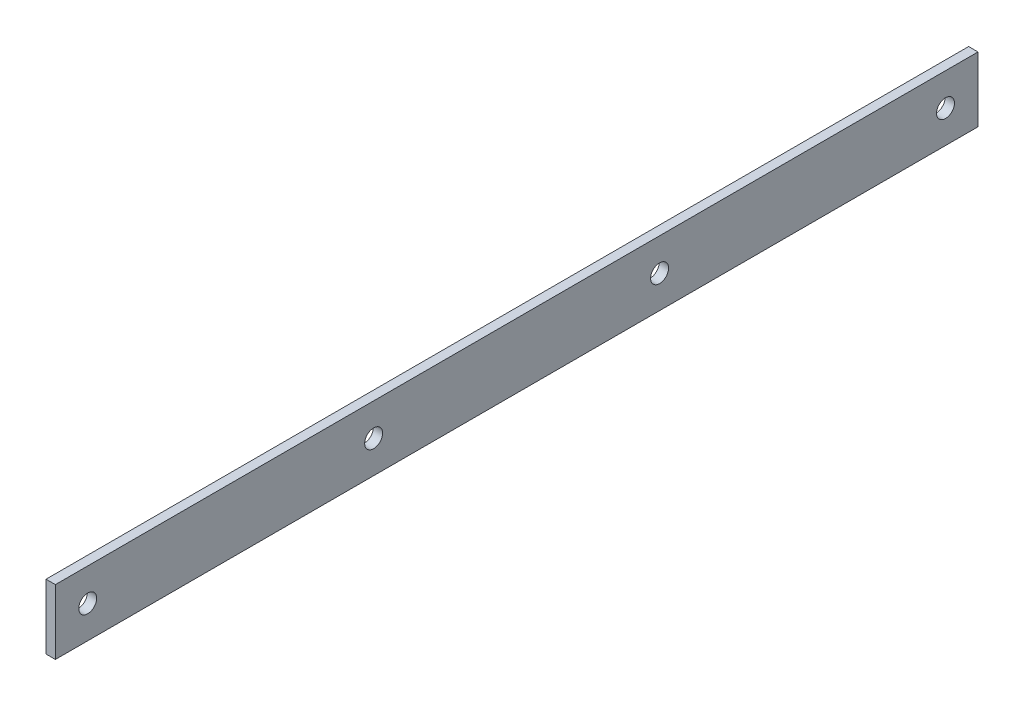
ISO-10303-21;
HEADER;
FILE_DESCRIPTION(('STEP AP214'),'2;1');
FILE_NAME('part.step','',(''),(''),'','','');
FILE_SCHEMA(('AUTOMOTIVE_DESIGN { 1 0 10303 214 1 1 1 1 }'));
ENDSEC;
DATA;
#1=APPLICATION_CONTEXT('core data for automotive mechanical design processes');
#2=APPLICATION_PROTOCOL_DEFINITION('international standard','automotive_design',2000,#1);
#3=PRODUCT_CONTEXT('',#1,'mechanical');
#4=PRODUCT('Part','Part','',(#3));
#5=PRODUCT_RELATED_PRODUCT_CATEGORY('part','',(#4));
#6=PRODUCT_DEFINITION_FORMATION('','',#4);
#7=PRODUCT_DEFINITION_CONTEXT('part definition',#1,'design');
#8=PRODUCT_DEFINITION('design','',#6,#7);
#9=PRODUCT_DEFINITION_SHAPE('','',#8);
#10=(LENGTH_UNIT() NAMED_UNIT(*) SI_UNIT(.MILLI.,.METRE.));
#11=(NAMED_UNIT(*) PLANE_ANGLE_UNIT() SI_UNIT($,.RADIAN.));
#12=(NAMED_UNIT(*) SI_UNIT($,.STERADIAN.) SOLID_ANGLE_UNIT());
#13=UNCERTAINTY_MEASURE_WITH_UNIT(LENGTH_MEASURE(1.E-05),#10,'distance_accuracy_value','');
#14=(GEOMETRIC_REPRESENTATION_CONTEXT(3) GLOBAL_UNCERTAINTY_ASSIGNED_CONTEXT((#13)) GLOBAL_UNIT_ASSIGNED_CONTEXT((#10,
#11,#12)) REPRESENTATION_CONTEXT('',''));
#15=CARTESIAN_POINT('',(0.,0.,0.));
#16=DIRECTION('',(0.,0.,1.));
#17=DIRECTION('',(1.,0.,0.));
#18=AXIS2_PLACEMENT_3D('',#15,#16,#17);
#19=CARTESIAN_POINT('',(0.,0.,-548.9));
#20=DIRECTION('',(1.,0.,0.));
#21=DIRECTION('',(0.,0.,-1.));
#22=AXIS2_PLACEMENT_3D('',#19,#20,#21);
#23=CYLINDRICAL_SURFACE('',#22,11.4999999999999);
#24=CARTESIAN_POINT('',(0.,0.,-548.9));
#25=DIRECTION('',(1.,0.,0.));
#26=DIRECTION('',(0.,0.,-1.));
#27=AXIS2_PLACEMENT_3D('',#24,#25,#26);
#28=CIRCLE('',#27,11.4999999999999);
#29=CARTESIAN_POINT('',(0.,0.,-560.4));
#30=VERTEX_POINT('',#29);
#31=EDGE_CURVE('E41',#30,#30,#28,.T.);
#32=ORIENTED_EDGE('',*,*,#31,.F.);
#33=EDGE_LOOP('',(#32));
#34=FACE_BOUND('',#33,.T.);
#35=CARTESIAN_POINT('',(12.,0.,-548.9));
#36=DIRECTION('',(1.,0.,0.));
#37=DIRECTION('',(0.,0.,-1.));
#38=AXIS2_PLACEMENT_3D('',#35,#36,#37);
#39=CIRCLE('',#38,11.4999999999999);
#40=CARTESIAN_POINT('',(12.,0.,-560.4));
#41=VERTEX_POINT('',#40);
#42=EDGE_CURVE('E11',#41,#41,#39,.T.);
#43=ORIENTED_EDGE('',*,*,#42,.T.);
#44=EDGE_LOOP('',(#43));
#45=FACE_BOUND('',#44,.T.);
#46=ADVANCED_FACE('F33',(#34,#45),#23,.F.);
#47=CARTESIAN_POINT('',(0.,0.,-182.9));
#48=DIRECTION('',(1.,0.,0.));
#49=DIRECTION('',(0.,0.,-1.));
#50=AXIS2_PLACEMENT_3D('',#47,#48,#49);
#51=CYLINDRICAL_SURFACE('',#50,11.4999999999999);
#52=CARTESIAN_POINT('',(0.,0.,-182.9));
#53=DIRECTION('',(1.,0.,0.));
#54=DIRECTION('',(0.,0.,-1.));
#55=AXIS2_PLACEMENT_3D('',#52,#53,#54);
#56=CIRCLE('',#55,11.4999999999999);
#57=CARTESIAN_POINT('',(0.,0.,-194.4));
#58=VERTEX_POINT('',#57);
#59=EDGE_CURVE('E111',#58,#58,#56,.T.);
#60=ORIENTED_EDGE('',*,*,#59,.F.);
#61=EDGE_LOOP('',(#60));
#62=FACE_BOUND('',#61,.T.);
#63=CARTESIAN_POINT('',(12.,0.,-182.9));
#64=DIRECTION('',(1.,0.,0.));
#65=DIRECTION('',(0.,0.,-1.));
#66=AXIS2_PLACEMENT_3D('',#63,#64,#65);
#67=CIRCLE('',#66,11.4999999999999);
#68=CARTESIAN_POINT('',(12.,0.,-194.4));
#69=VERTEX_POINT('',#68);
#70=EDGE_CURVE('E114',#69,#69,#67,.T.);
#71=ORIENTED_EDGE('',*,*,#70,.T.);
#72=EDGE_LOOP('',(#71));
#73=FACE_BOUND('',#72,.T.);
#74=ADVANCED_FACE('F123',(#62,#73),#51,.F.);
#75=CARTESIAN_POINT('',(12.,-41.5,-590.5));
#76=DIRECTION('',(0.,0.,1.));
#77=DIRECTION('',(1.,0.,0.));
#78=AXIS2_PLACEMENT_3D('',#75,#76,#77);
#79=PLANE('',#78);
#80=DIRECTION('',(0.,1.,0.));
#81=VECTOR('',#80,1.);
#82=CARTESIAN_POINT('',(0.,-41.5,-590.5));
#83=LINE('',#82,#81);
#84=CARTESIAN_POINT('',(0.,-41.5,-590.5));
#85=VERTEX_POINT('',#84);
#86=CARTESIAN_POINT('',(0.,41.5,-590.5));
#87=VERTEX_POINT('',#86);
#88=EDGE_CURVE('E101',#85,#87,#83,.T.);
#89=ORIENTED_EDGE('',*,*,#88,.T.);
#90=DIRECTION('',(-1.,0.,0.));
#91=VECTOR('',#90,1.);
#92=CARTESIAN_POINT('',(12.,41.5,-590.5));
#93=LINE('',#92,#91);
#94=CARTESIAN_POINT('',(12.,41.5,-590.5));
#95=VERTEX_POINT('',#94);
#96=EDGE_CURVE('E92',#95,#87,#93,.T.);
#97=ORIENTED_EDGE('',*,*,#96,.F.);
#98=DIRECTION('',(0.,1.,0.));
#99=VECTOR('',#98,1.);
#100=CARTESIAN_POINT('',(12.,-41.5,-590.5));
#101=LINE('',#100,#99);
#102=CARTESIAN_POINT('',(12.,-41.5,-590.5));
#103=VERTEX_POINT('',#102);
#104=EDGE_CURVE('E86',#103,#95,#101,.T.);
#105=ORIENTED_EDGE('',*,*,#104,.F.);
#106=DIRECTION('',(-1.,0.,0.));
#107=VECTOR('',#106,1.);
#108=CARTESIAN_POINT('',(12.,-41.5,-590.5));
#109=LINE('',#108,#107);
#110=EDGE_CURVE('E97',#103,#85,#109,.T.);
#111=ORIENTED_EDGE('',*,*,#110,.T.);
#112=EDGE_LOOP('',(#89,#97,#105,#111));
#113=FACE_BOUND('',#112,.T.);
#114=ADVANCED_FACE('F147',(#113),#79,.F.);
#115=CARTESIAN_POINT('',(12.,41.5,590.5));
#116=DIRECTION('',(0.,-1.,0.));
#117=DIRECTION('',(0.,0.,-1.));
#118=AXIS2_PLACEMENT_3D('',#115,#116,#117);
#119=PLANE('',#118);
#120=DIRECTION('',(0.,0.,1.));
#121=VECTOR('',#120,1.);
#122=CARTESIAN_POINT('',(0.,41.5,590.5));
#123=LINE('',#122,#121);
#124=CARTESIAN_POINT('',(0.,41.5,590.5));
#125=VERTEX_POINT('',#124);
#126=EDGE_CURVE('E91',#87,#125,#123,.T.);
#127=ORIENTED_EDGE('',*,*,#126,.T.);
#128=DIRECTION('',(-1.,0.,0.));
#129=VECTOR('',#128,1.);
#130=CARTESIAN_POINT('',(12.,41.5,590.5));
#131=LINE('',#130,#129);
#132=CARTESIAN_POINT('',(12.,41.5,590.5));
#133=VERTEX_POINT('',#132);
#134=EDGE_CURVE('E89',#133,#125,#131,.T.);
#135=ORIENTED_EDGE('',*,*,#134,.F.);
#136=DIRECTION('',(0.,0.,1.));
#137=VECTOR('',#136,1.);
#138=CARTESIAN_POINT('',(12.,41.5,590.5));
#139=LINE('',#138,#137);
#140=EDGE_CURVE('E80',#95,#133,#139,.T.);
#141=ORIENTED_EDGE('',*,*,#140,.F.);
#142=ORIENTED_EDGE('',*,*,#96,.T.);
#143=EDGE_LOOP('',(#127,#135,#141,#142));
#144=FACE_BOUND('',#143,.T.);
#145=ADVANCED_FACE('F90',(#144),#119,.F.);
#146=CARTESIAN_POINT('',(12.,-41.5,590.5));
#147=DIRECTION('',(0.,0.,-1.));
#148=DIRECTION('',(-1.,0.,0.));
#149=AXIS2_PLACEMENT_3D('',#146,#147,#148);
#150=PLANE('',#149);
#151=DIRECTION('',(0.,-1.,0.));
#152=VECTOR('',#151,1.);
#153=CARTESIAN_POINT('',(0.,-41.5,590.5));
#154=LINE('',#153,#152);
#155=CARTESIAN_POINT('',(0.,-41.5,590.5));
#156=VERTEX_POINT('',#155);
#157=EDGE_CURVE('E66',#125,#156,#154,.T.);
#158=ORIENTED_EDGE('',*,*,#157,.T.);
#159=DIRECTION('',(-1.,0.,0.));
#160=VECTOR('',#159,1.);
#161=CARTESIAN_POINT('',(12.,-41.5,590.5));
#162=LINE('',#161,#160);
#163=CARTESIAN_POINT('',(12.,-41.5,590.5));
#164=VERTEX_POINT('',#163);
#165=EDGE_CURVE('E93',#164,#156,#162,.T.);
#166=ORIENTED_EDGE('',*,*,#165,.F.);
#167=DIRECTION('',(0.,-1.,0.));
#168=VECTOR('',#167,1.);
#169=CARTESIAN_POINT('',(12.,-41.5,590.5));
#170=LINE('',#169,#168);
#171=EDGE_CURVE('E84',#133,#164,#170,.T.);
#172=ORIENTED_EDGE('',*,*,#171,.F.);
#173=ORIENTED_EDGE('',*,*,#134,.T.);
#174=EDGE_LOOP('',(#158,#166,#172,#173));
#175=FACE_BOUND('',#174,.T.);
#176=ADVANCED_FACE('F95',(#175),#150,.F.);
#177=CARTESIAN_POINT('',(12.,-41.5,590.5));
#178=DIRECTION('',(0.,1.,0.));
#179=DIRECTION('',(0.,0.,1.));
#180=AXIS2_PLACEMENT_3D('',#177,#178,#179);
#181=PLANE('',#180);
#182=DIRECTION('',(0.,0.,-1.));
#183=VECTOR('',#182,1.);
#184=CARTESIAN_POINT('',(0.,-41.5,590.5));
#185=LINE('',#184,#183);
#186=EDGE_CURVE('E72',#156,#85,#185,.T.);
#187=ORIENTED_EDGE('',*,*,#186,.T.);
#188=ORIENTED_EDGE('',*,*,#110,.F.);
#189=DIRECTION('',(0.,0.,-1.));
#190=VECTOR('',#189,1.);
#191=CARTESIAN_POINT('',(12.,-41.5,590.5));
#192=LINE('',#191,#190);
#193=EDGE_CURVE('E49',#164,#103,#192,.T.);
#194=ORIENTED_EDGE('',*,*,#193,.F.);
#195=ORIENTED_EDGE('',*,*,#165,.T.);
#196=EDGE_LOOP('',(#187,#188,#194,#195));
#197=FACE_BOUND('',#196,.T.);
#198=ADVANCED_FACE('F127',(#197),#181,.F.);
#199=CARTESIAN_POINT('',(12.,0.,0.));
#200=DIRECTION('',(-1.,0.,0.));
#201=DIRECTION('',(0.,0.,1.));
#202=AXIS2_PLACEMENT_3D('',#199,#200,#201);
#203=PLANE('',#202);
#204=CARTESIAN_POINT('',(12.,0.,183.1));
#205=DIRECTION('',(1.,0.,0.));
#206=DIRECTION('',(0.,0.,-1.));
#207=AXIS2_PLACEMENT_3D('',#204,#205,#206);
#208=CIRCLE('',#207,11.4999999999999);
#209=CARTESIAN_POINT('',(12.,0.,171.6));
#210=VERTEX_POINT('',#209);
#211=EDGE_CURVE('E218',#210,#210,#208,.T.);
#212=ORIENTED_EDGE('',*,*,#211,.F.);
#213=EDGE_LOOP('',(#212));
#214=FACE_BOUND('',#213,.T.);
#215=CARTESIAN_POINT('',(12.,0.,549.1));
#216=DIRECTION('',(1.,0.,0.));
#217=DIRECTION('',(0.,0.,-1.));
#218=AXIS2_PLACEMENT_3D('',#215,#216,#217);
#219=CIRCLE('',#218,11.4999999999999);
#220=CARTESIAN_POINT('',(12.,0.,537.6));
#221=VERTEX_POINT('',#220);
#222=EDGE_CURVE('E219',#221,#221,#219,.T.);
#223=ORIENTED_EDGE('',*,*,#222,.F.);
#224=EDGE_LOOP('',(#223));
#225=FACE_BOUND('',#224,.T.);
#226=ORIENTED_EDGE('',*,*,#104,.T.);
#227=ORIENTED_EDGE('',*,*,#140,.T.);
#228=ORIENTED_EDGE('',*,*,#171,.T.);
#229=ORIENTED_EDGE('',*,*,#193,.T.);
#230=EDGE_LOOP('',(#226,#227,#228,#229));
#231=FACE_BOUND('',#230,.T.);
#232=ORIENTED_EDGE('',*,*,#70,.F.);
#233=EDGE_LOOP('',(#232));
#234=FACE_BOUND('',#233,.T.);
#235=ORIENTED_EDGE('',*,*,#42,.F.);
#236=EDGE_LOOP('',(#235));
#237=FACE_BOUND('',#236,.T.);
#238=ADVANCED_FACE('F81',(#214,#225,#231,#234,#237),#203,.F.);
#239=CARTESIAN_POINT('',(0.,0.,0.));
#240=DIRECTION('',(-1.,0.,0.));
#241=DIRECTION('',(0.,0.,1.));
#242=AXIS2_PLACEMENT_3D('',#239,#240,#241);
#243=PLANE('',#242);
#244=CARTESIAN_POINT('',(0.,0.,183.1));
#245=DIRECTION('',(1.,0.,0.));
#246=DIRECTION('',(0.,0.,-1.));
#247=AXIS2_PLACEMENT_3D('',#244,#245,#246);
#248=CIRCLE('',#247,11.4999999999999);
#249=CARTESIAN_POINT('',(0.,0.,171.6));
#250=VERTEX_POINT('',#249);
#251=EDGE_CURVE('E216',#250,#250,#248,.T.);
#252=ORIENTED_EDGE('',*,*,#251,.T.);
#253=EDGE_LOOP('',(#252));
#254=FACE_BOUND('',#253,.T.);
#255=CARTESIAN_POINT('',(0.,0.,549.1));
#256=DIRECTION('',(1.,0.,0.));
#257=DIRECTION('',(0.,0.,-1.));
#258=AXIS2_PLACEMENT_3D('',#255,#256,#257);
#259=CIRCLE('',#258,11.4999999999999);
#260=CARTESIAN_POINT('',(0.,0.,537.6));
#261=VERTEX_POINT('',#260);
#262=EDGE_CURVE('E104',#261,#261,#259,.T.);
#263=ORIENTED_EDGE('',*,*,#262,.T.);
#264=EDGE_LOOP('',(#263));
#265=FACE_BOUND('',#264,.T.);
#266=ORIENTED_EDGE('',*,*,#88,.F.);
#267=ORIENTED_EDGE('',*,*,#186,.F.);
#268=ORIENTED_EDGE('',*,*,#157,.F.);
#269=ORIENTED_EDGE('',*,*,#126,.F.);
#270=EDGE_LOOP('',(#266,#267,#268,#269));
#271=FACE_BOUND('',#270,.T.);
#272=ORIENTED_EDGE('',*,*,#59,.T.);
#273=EDGE_LOOP('',(#272));
#274=FACE_BOUND('',#273,.T.);
#275=ORIENTED_EDGE('',*,*,#31,.T.);
#276=EDGE_LOOP('',(#275));
#277=FACE_BOUND('',#276,.T.);
#278=ADVANCED_FACE('F119',(#254,#265,#271,#274,#277),#243,.T.);
#279=CARTESIAN_POINT('',(0.,0.,549.1));
#280=DIRECTION('',(1.,0.,0.));
#281=DIRECTION('',(0.,0.,-1.));
#282=AXIS2_PLACEMENT_3D('',#279,#280,#281);
#283=CYLINDRICAL_SURFACE('',#282,11.4999999999999);
#284=ORIENTED_EDGE('',*,*,#262,.F.);
#285=EDGE_LOOP('',(#284));
#286=FACE_BOUND('',#285,.T.);
#287=ORIENTED_EDGE('',*,*,#222,.T.);
#288=EDGE_LOOP('',(#287));
#289=FACE_BOUND('',#288,.T.);
#290=ADVANCED_FACE('F134',(#286,#289),#283,.F.);
#291=CARTESIAN_POINT('',(0.,0.,183.1));
#292=DIRECTION('',(1.,0.,0.));
#293=DIRECTION('',(0.,0.,-1.));
#294=AXIS2_PLACEMENT_3D('',#291,#292,#293);
#295=CYLINDRICAL_SURFACE('',#294,11.4999999999999);
#296=ORIENTED_EDGE('',*,*,#251,.F.);
#297=EDGE_LOOP('',(#296));
#298=FACE_BOUND('',#297,.T.);
#299=ORIENTED_EDGE('',*,*,#211,.T.);
#300=EDGE_LOOP('',(#299));
#301=FACE_BOUND('',#300,.T.);
#302=ADVANCED_FACE('F185',(#298,#301),#295,.F.);
#303=CLOSED_SHELL('',(#46,#74,#114,#145,#176,#198,#238,#278,#290,#302));
#304=MANIFOLD_SOLID_BREP('B2',#303);
#305=ADVANCED_BREP_SHAPE_REPRESENTATION('',(#18,#304),#14);
#306=SHAPE_DEFINITION_REPRESENTATION(#9,#305);
ENDSEC;
END-ISO-10303-21;
